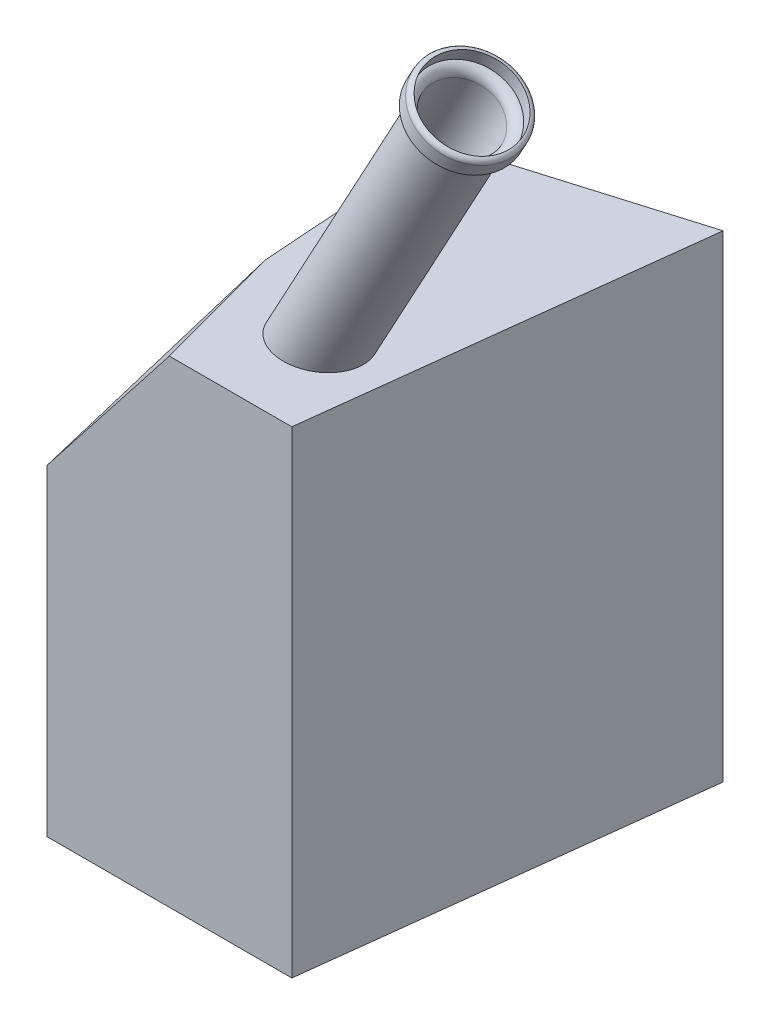
ISO-10303-21;
HEADER;
FILE_DESCRIPTION(('STEP AP214'),'2;1');
FILE_NAME('part.step','',(''),(''),'','','');
FILE_SCHEMA(('AUTOMOTIVE_DESIGN { 1 0 10303 214 1 1 1 1 }'));
ENDSEC;
DATA;
#1=APPLICATION_CONTEXT('core data for automotive mechanical design processes');
#2=APPLICATION_PROTOCOL_DEFINITION('international standard','automotive_design',2000,#1);
#3=PRODUCT_CONTEXT('',#1,'mechanical');
#4=PRODUCT('Part','Part','',(#3));
#5=PRODUCT_RELATED_PRODUCT_CATEGORY('part','',(#4));
#6=PRODUCT_DEFINITION_FORMATION('','',#4);
#7=PRODUCT_DEFINITION_CONTEXT('part definition',#1,'design');
#8=PRODUCT_DEFINITION('design','',#6,#7);
#9=PRODUCT_DEFINITION_SHAPE('','',#8);
#10=(LENGTH_UNIT() NAMED_UNIT(*) SI_UNIT(.MILLI.,.METRE.));
#11=(NAMED_UNIT(*) PLANE_ANGLE_UNIT() SI_UNIT($,.RADIAN.));
#12=(NAMED_UNIT(*) SI_UNIT($,.STERADIAN.) SOLID_ANGLE_UNIT());
#13=UNCERTAINTY_MEASURE_WITH_UNIT(LENGTH_MEASURE(1.E-05),#10,'distance_accuracy_value','');
#14=(GEOMETRIC_REPRESENTATION_CONTEXT(3) GLOBAL_UNCERTAINTY_ASSIGNED_CONTEXT((#13)) GLOBAL_UNIT_ASSIGNED_CONTEXT((#10,
#11,#12)) REPRESENTATION_CONTEXT('',''));
#15=CARTESIAN_POINT('',(0.,0.,0.));
#16=DIRECTION('',(0.,0.,1.));
#17=DIRECTION('',(1.,0.,0.));
#18=AXIS2_PLACEMENT_3D('',#15,#16,#17);
#19=CARTESIAN_POINT('',(81.5417679167685,226.726887822991,-50.2463743663815));
#20=DIRECTION('',(0.496489479395559,0.866025403784438,0.0591455564647714));
#21=DIRECTION('',(-0.867544153281162,0.497360173423316,0.));
#22=AXIS2_PLACEMENT_3D('',#19,#20,#21);
#23=CYLINDRICAL_SURFACE('',#22,20.3962);
#24=CARTESIAN_POINT('',(182.428430129946,402.703249871989,-38.2279972927399));
#25=DIRECTION('',(0.496489479395559,0.866025403784438,0.0591455564647714));
#26=DIRECTION('',(-0.867544153281162,0.497360173423316,0.));
#27=AXIS2_PLACEMENT_3D('',#24,#25,#26);
#28=CIRCLE('',#27,20.3962);
#29=CARTESIAN_POINT('',(164.733826070793,412.847507441165,-38.2279972927399));
#30=VERTEX_POINT('',#29);
#31=EDGE_CURVE('E121',#30,#30,#28,.F.);
#32=ORIENTED_EDGE('',*,*,#31,.T.);
#33=EDGE_LOOP('',(#32));
#34=FACE_BOUND('',#33,.T.);
#35=CARTESIAN_POINT('',(97.177352285412,254.,-48.3837461002978));
#36=DIRECTION('',(0.,-1.,0.));
#37=DIRECTION('',(0.992978958791117,0.,0.118291112929543));
#38=AXIS2_PLACEMENT_3D('',#35,#36,#37);
#39=ELLIPSE('',#38,23.5515031208909,20.3962);
#40=CARTESIAN_POINT('',(120.56349933236,254.,-45.5978125849641));
#41=VERTEX_POINT('',#40);
#42=EDGE_CURVE('E122',#41,#41,#39,.T.);
#43=ORIENTED_EDGE('',*,*,#42,.F.);
#44=EDGE_LOOP('',(#43));
#45=FACE_BOUND('',#44,.T.);
#46=ADVANCED_FACE('F34',(#34,#45),#23,.T.);
#47=CARTESIAN_POINT('',(0.,254.,0.));
#48=DIRECTION('',(0.,0.,-1.));
#49=DIRECTION('',(-1.,0.,0.));
#50=AXIS2_PLACEMENT_3D('',#47,#48,#49);
#51=PLANE('',#50);
#52=DIRECTION('',(-0.617653203910178,-0.78645058312617,0.));
#53=VECTOR('',#52,1.);
#54=CARTESIAN_POINT('',(65.151,254.,0.));
#55=LINE('',#54,#53);
#56=CARTESIAN_POINT('',(65.151,254.,0.));
#57=VERTEX_POINT('',#56);
#58=CARTESIAN_POINT('',(0.,171.043995535229,0.));
#59=VERTEX_POINT('',#58);
#60=EDGE_CURVE('E103',#57,#59,#55,.T.);
#61=ORIENTED_EDGE('',*,*,#60,.T.);
#62=DIRECTION('',(0.,-1.,0.));
#63=VECTOR('',#62,1.);
#64=CARTESIAN_POINT('',(0.,254.,0.));
#65=LINE('',#64,#63);
#66=CARTESIAN_POINT('',(0.,0.,0.));
#67=VERTEX_POINT('',#66);
#68=EDGE_CURVE('E116',#59,#67,#65,.T.);
#69=ORIENTED_EDGE('',*,*,#68,.T.);
#70=DIRECTION('',(1.,0.,0.));
#71=VECTOR('',#70,1.);
#72=CARTESIAN_POINT('',(0.,0.,0.));
#73=LINE('',#72,#71);
#74=CARTESIAN_POINT('',(130.302,0.,0.));
#75=VERTEX_POINT('',#74);
#76=EDGE_CURVE('E102',#67,#75,#73,.T.);
#77=ORIENTED_EDGE('',*,*,#76,.T.);
#78=DIRECTION('',(0.,-1.,0.));
#79=VECTOR('',#78,1.);
#80=CARTESIAN_POINT('',(130.302,254.,0.));
#81=LINE('',#80,#79);
#82=CARTESIAN_POINT('',(130.302,254.,0.));
#83=VERTEX_POINT('',#82);
#84=EDGE_CURVE('E113',#83,#75,#81,.T.);
#85=ORIENTED_EDGE('',*,*,#84,.F.);
#86=DIRECTION('',(1.,0.,0.));
#87=VECTOR('',#86,1.);
#88=CARTESIAN_POINT('',(0.,254.,0.));
#89=LINE('',#88,#87);
#90=EDGE_CURVE('E97',#57,#83,#89,.T.);
#91=ORIENTED_EDGE('',*,*,#90,.F.);
#92=EDGE_LOOP('',(#61,#69,#77,#85,#91));
#93=FACE_BOUND('',#92,.T.);
#94=ADVANCED_FACE('F141',(#93),#51,.F.);
#95=CARTESIAN_POINT('',(-52.1238698428315,254.,-143.209155407773));
#96=DIRECTION('',(0.939692620785909,0.,-0.342020143325666));
#97=DIRECTION('',(-0.342020143325666,0.,-0.939692620785909));
#98=AXIS2_PLACEMENT_3D('',#95,#96,#97);
#99=PLANE('',#98);
#100=ORIENTED_EDGE('',*,*,#68,.F.);
#101=DIRECTION('',(-0.312423370490764,-0.40691769786989,-0.858376155733289));
#102=VECTOR('',#101,1.);
#103=CARTESIAN_POINT('',(-32.9468480454813,128.132175149715,-90.5207210471635));
#104=LINE('',#103,#102);
#105=CARTESIAN_POINT('',(-52.1238698428315,103.154947775462,-143.209155407773));
#106=VERTEX_POINT('',#105);
#107=EDGE_CURVE('E84',#59,#106,#104,.T.);
#108=ORIENTED_EDGE('',*,*,#107,.T.);
#109=DIRECTION('',(0.,-1.,0.));
#110=VECTOR('',#109,1.);
#111=CARTESIAN_POINT('',(-52.1238698428315,254.,-143.209155407773));
#112=LINE('',#111,#110);
#113=CARTESIAN_POINT('',(-52.1238698428315,0.,-143.209155407773));
#114=VERTEX_POINT('',#113);
#115=EDGE_CURVE('E76',#106,#114,#112,.T.);
#116=ORIENTED_EDGE('',*,*,#115,.T.);
#117=DIRECTION('',(0.342020143325666,0.,0.939692620785909));
#118=VECTOR('',#117,1.);
#119=CARTESIAN_POINT('',(-52.1238698428315,0.,-143.209155407773));
#120=LINE('',#119,#118);
#121=EDGE_CURVE('E81',#114,#67,#120,.T.);
#122=ORIENTED_EDGE('',*,*,#121,.T.);
#123=EDGE_LOOP('',(#100,#108,#116,#122));
#124=FACE_BOUND('',#123,.T.);
#125=ADVANCED_FACE('F79',(#124),#99,.F.);
#126=CARTESIAN_POINT('',(130.302,254.,0.));
#127=DIRECTION('',(-0.992978958791117,0.,-0.118291112929543));
#128=DIRECTION('',(-0.118291112929543,0.,0.992978958791117));
#129=AXIS2_PLACEMENT_3D('',#126,#127,#128);
#130=PLANE('',#129);
#131=DIRECTION('',(0.118291112929543,0.,-0.992978958791117));
#132=VECTOR('',#131,1.);
#133=CARTESIAN_POINT('',(130.302,0.,0.));
#134=LINE('',#133,#132);
#135=CARTESIAN_POINT('',(154.729351402176,0.,-205.052140948283));
#136=VERTEX_POINT('',#135);
#137=EDGE_CURVE('E98',#75,#136,#134,.T.);
#138=ORIENTED_EDGE('',*,*,#137,.T.);
#139=DIRECTION('',(0.,-1.,0.));
#140=VECTOR('',#139,1.);
#141=CARTESIAN_POINT('',(154.729351402176,254.,-205.052140948283));
#142=LINE('',#141,#140);
#143=CARTESIAN_POINT('',(154.729351402176,254.,-205.052140948283));
#144=VERTEX_POINT('',#143);
#145=EDGE_CURVE('E87',#144,#136,#142,.T.);
#146=ORIENTED_EDGE('',*,*,#145,.F.);
#147=DIRECTION('',(0.118291112929543,0.,-0.992978958791117));
#148=VECTOR('',#147,1.);
#149=CARTESIAN_POINT('',(130.302,254.,0.));
#150=LINE('',#149,#148);
#151=EDGE_CURVE('E56',#83,#144,#150,.T.);
#152=ORIENTED_EDGE('',*,*,#151,.F.);
#153=ORIENTED_EDGE('',*,*,#84,.T.);
#154=EDGE_LOOP('',(#138,#146,#152,#153));
#155=FACE_BOUND('',#154,.T.);
#156=ADVANCED_FACE('F289',(#155),#130,.F.);
#157=CARTESIAN_POINT('',(154.729351402176,254.,-205.052140948283));
#158=DIRECTION('',(0.286442730618391,0.,0.958097365655433));
#159=DIRECTION('',(0.958097365655433,0.,-0.286442730618391));
#160=AXIS2_PLACEMENT_3D('',#157,#158,#159);
#161=PLANE('',#160);
#162=ORIENTED_EDGE('',*,*,#115,.F.);
#163=DIRECTION('',(0.512039136018785,0.84521065349225,-0.153084533537326));
#164=VECTOR('',#163,1.);
#165=CARTESIAN_POINT('',(72.240192671489,308.439706604567,-180.390326063668));
#166=LINE('',#165,#164);
#167=CARTESIAN_POINT('',(39.2599406837229,254.,-170.530207693135));
#168=VERTEX_POINT('',#167);
#169=EDGE_CURVE('E156',#106,#168,#166,.T.);
#170=ORIENTED_EDGE('',*,*,#169,.T.);
#171=DIRECTION('',(-0.958097365655433,0.,0.286442730618391));
#172=VECTOR('',#171,1.);
#173=CARTESIAN_POINT('',(154.729351402176,254.,-205.052140948283));
#174=LINE('',#173,#172);
#175=EDGE_CURVE('E88',#144,#168,#174,.T.);
#176=ORIENTED_EDGE('',*,*,#175,.F.);
#177=ORIENTED_EDGE('',*,*,#145,.T.);
#178=DIRECTION('',(-0.958097365655433,0.,0.286442730618391));
#179=VECTOR('',#178,1.);
#180=CARTESIAN_POINT('',(154.729351402176,0.,-205.052140948283));
#181=LINE('',#180,#179);
#182=EDGE_CURVE('E92',#136,#114,#181,.T.);
#183=ORIENTED_EDGE('',*,*,#182,.T.);
#184=EDGE_LOOP('',(#162,#170,#176,#177,#183));
#185=FACE_BOUND('',#184,.T.);
#186=ADVANCED_FACE('F93',(#185),#161,.F.);
#187=CARTESIAN_POINT('',(0.,254.,0.));
#188=DIRECTION('',(0.,-1.,0.));
#189=DIRECTION('',(0.,0.,-1.));
#190=AXIS2_PLACEMENT_3D('',#187,#188,#189);
#191=PLANE('',#190);
#192=ORIENTED_EDGE('',*,*,#42,.T.);
#193=EDGE_LOOP('',(#192));
#194=FACE_BOUND('',#193,.T.);
#195=ORIENTED_EDGE('',*,*,#175,.T.);
#196=DIRECTION('',(0.0705343070797414,0.,0.997509354103901));
#197=VECTOR('',#196,1.);
#198=CARTESIAN_POINT('',(51.0628909793131,254.,-3.61067855443798));
#199=LINE('',#198,#197);
#200=CARTESIAN_POINT('',(46.3783747708351,254.,-69.859982345364));
#201=VERTEX_POINT('',#200);
#202=EDGE_CURVE('E125',#168,#201,#199,.T.);
#203=ORIENTED_EDGE('',*,*,#202,.T.);
#204=DIRECTION('',(0.259511588226898,0.,0.965739993774697));
#205=VECTOR('',#204,1.);
#206=CARTESIAN_POINT('',(65.151,254.,0.));
#207=LINE('',#206,#205);
#208=EDGE_CURVE('E49',#201,#57,#207,.T.);
#209=ORIENTED_EDGE('',*,*,#208,.T.);
#210=ORIENTED_EDGE('',*,*,#90,.T.);
#211=ORIENTED_EDGE('',*,*,#151,.T.);
#212=EDGE_LOOP('',(#195,#203,#209,#210,#211));
#213=FACE_BOUND('',#212,.T.);
#214=ADVANCED_FACE('F145',(#194,#213),#191,.F.);
#215=CARTESIAN_POINT('',(0.,0.,0.));
#216=DIRECTION('',(0.,-1.,0.));
#217=DIRECTION('',(0.,0.,-1.));
#218=AXIS2_PLACEMENT_3D('',#215,#216,#217);
#219=PLANE('',#218);
#220=ORIENTED_EDGE('',*,*,#121,.F.);
#221=ORIENTED_EDGE('',*,*,#182,.F.);
#222=ORIENTED_EDGE('',*,*,#137,.F.);
#223=ORIENTED_EDGE('',*,*,#76,.F.);
#224=EDGE_LOOP('',(#220,#221,#222,#223));
#225=FACE_BOUND('',#224,.T.);
#226=ADVANCED_FACE('F101',(#225),#219,.T.);
#227=CARTESIAN_POINT('',(-79.533165386549,62.4628113604426,21.3719823132758));
#228=DIRECTION('',(-0.769455640153619,0.604305917758337,0.206766476001402));
#229=DIRECTION('',(-0.617653203910178,-0.78645058312617,0.));
#230=AXIS2_PLACEMENT_3D('',#227,#228,#229);
#231=PLANE('',#230);
#232=DIRECTION('',(0.393191435141361,0.703293088864513,-0.592266263167917));
#233=VECTOR('',#232,1.);
#234=CARTESIAN_POINT('',(-47.2985940713895,86.4420145397452,71.24611336889));
#235=LINE('',#234,#233);
#236=EDGE_CURVE('E118',#59,#201,#235,.T.);
#237=ORIENTED_EDGE('',*,*,#236,.F.);
#238=ORIENTED_EDGE('',*,*,#60,.F.);
#239=ORIENTED_EDGE('',*,*,#208,.F.);
#240=EDGE_LOOP('',(#237,#238,#239));
#241=FACE_BOUND('',#240,.T.);
#242=ADVANCED_FACE('F284',(#241),#231,.T.);
#243=CARTESIAN_POINT('',(-76.2498459165135,47.1696430068731,5.39165875942065));
#244=DIRECTION('',(0.848894577085888,-0.5251427549828,-0.0600256935257437));
#245=DIRECTION('',(0.526091385950051,0.85042804141747,0.));
#246=AXIS2_PLACEMENT_3D('',#243,#244,#245);
#247=PLANE('',#246);
#248=ORIENTED_EDGE('',*,*,#236,.T.);
#249=ORIENTED_EDGE('',*,*,#202,.F.);
#250=ORIENTED_EDGE('',*,*,#169,.F.);
#251=ORIENTED_EDGE('',*,*,#107,.F.);
#252=EDGE_LOOP('',(#248,#249,#250,#251));
#253=FACE_BOUND('',#252,.T.);
#254=ADVANCED_FACE('F282',(#253),#247,.F.);
#255=CARTESIAN_POINT('',(183.689513407611,404.902954397601,-38.0777675793194));
#256=DIRECTION('',(0.496489479395559,0.866025403784438,0.0591455564647714));
#257=DIRECTION('',(-0.867544153281162,0.497360173423316,0.));
#258=AXIS2_PLACEMENT_3D('',#255,#256,#257);
#259=CYLINDRICAL_SURFACE('',#258,25.4762);
#260=CARTESIAN_POINT('',(187.472763240605,411.502067974438,-37.6270784390579));
#261=DIRECTION('',(0.496489479395559,0.866025403784438,0.0591455564647714));
#262=DIRECTION('',(-0.867544153281162,0.497360173423316,0.));
#263=AXIS2_PLACEMENT_3D('',#260,#261,#262);
#264=CIRCLE('',#263,25.4762);
#265=CARTESIAN_POINT('',(165.371034882783,424.172915224605,-37.6270784390579));
#266=VERTEX_POINT('',#265);
#267=EDGE_CURVE('E11',#266,#266,#264,.F.);
#268=ORIENTED_EDGE('',*,*,#267,.T.);
#269=EDGE_LOOP('',(#268));
#270=FACE_BOUND('',#269,.T.);
#271=CARTESIAN_POINT('',(183.689513407611,404.902954397601,-38.0777675793194));
#272=DIRECTION('',(0.496489479395559,0.866025403784438,0.0591455564647714));
#273=DIRECTION('',(-0.867544153281162,0.497360173423316,0.));
#274=AXIS2_PLACEMENT_3D('',#271,#272,#273);
#275=CIRCLE('',#274,25.4762);
#276=CARTESIAN_POINT('',(161.587785049789,417.573801647768,-38.0777675793194));
#277=VERTEX_POINT('',#276);
#278=EDGE_CURVE('E126',#277,#277,#275,.T.);
#279=ORIENTED_EDGE('',*,*,#278,.T.);
#280=EDGE_LOOP('',(#279));
#281=FACE_BOUND('',#280,.T.);
#282=ADVANCED_FACE('F336',(#270,#281),#259,.T.);
#283=CARTESIAN_POINT('',(183.689513407611,404.902954397601,-38.0777675793194));
#284=DIRECTION('',(0.496489479395559,0.866025403784438,0.0591455564647714));
#285=DIRECTION('',(-0.867544153281162,0.497360173423316,0.));
#286=AXIS2_PLACEMENT_3D('',#283,#284,#285);
#287=PLANE('',#286);
#288=CARTESIAN_POINT('',(183.689513407611,404.902954397601,-38.0777675793194));
#289=DIRECTION('',(0.496489479395559,0.866025403784438,0.0591455564647714));
#290=DIRECTION('',(-0.867544153281162,0.497360173423316,0.));
#291=AXIS2_PLACEMENT_3D('',#288,#289,#290);
#292=CIRCLE('',#291,22.9362);
#293=CARTESIAN_POINT('',(163.791347199124,416.310506807273,-38.0777675793194));
#294=VERTEX_POINT('',#293);
#295=EDGE_CURVE('E42',#294,#294,#292,.T.);
#296=ORIENTED_EDGE('',*,*,#295,.T.);
#297=EDGE_LOOP('',(#296));
#298=FACE_BOUND('',#297,.T.);
#299=ORIENTED_EDGE('',*,*,#278,.F.);
#300=EDGE_LOOP('',(#299));
#301=FACE_BOUND('',#300,.T.);
#302=ADVANCED_FACE('F131',(#298,#301),#287,.F.);
#303=CARTESIAN_POINT('',(182.428430129946,402.703249871989,-38.2279972927399));
#304=DIRECTION('',(0.496489479395559,0.866025403784438,0.0591455564647714));
#305=DIRECTION('',(-0.867544153281162,0.497360173423316,0.));
#306=AXIS2_PLACEMENT_3D('',#303,#304,#305);
#307=TOROIDAL_SURFACE('',#306,22.9362,2.54);
#308=ORIENTED_EDGE('',*,*,#295,.F.);
#309=EDGE_LOOP('',(#308));
#310=FACE_BOUND('',#309,.T.);
#311=ORIENTED_EDGE('',*,*,#31,.F.);
#312=EDGE_LOOP('',(#311));
#313=FACE_BOUND('',#312,.T.);
#314=ADVANCED_FACE('F134',(#310,#313),#307,.F.);
#315=CARTESIAN_POINT('',(187.472763240605,411.502067974438,-37.6270784390579));
#316=DIRECTION('',(0.496489479395559,0.866025403784438,0.0591455564647714));
#317=DIRECTION('',(-0.867544153281162,0.497360173423316,0.));
#318=AXIS2_PLACEMENT_3D('',#315,#316,#317);
#319=TOROIDAL_SURFACE('',#318,22.9362,2.54);
#320=ORIENTED_EDGE('',*,*,#267,.F.);
#321=EDGE_LOOP('',(#320));
#322=FACE_BOUND('',#321,.T.);
#323=CARTESIAN_POINT('',(188.73384651827,413.701772500051,-37.4768487256373));
#324=DIRECTION('',(0.496489479395559,0.866025403784438,0.0591455564647714));
#325=DIRECTION('',(-0.867544153281162,0.497360173423316,0.));
#326=AXIS2_PLACEMENT_3D('',#323,#324,#325);
#327=CIRCLE('',#326,22.9362);
#328=CARTESIAN_POINT('',(168.835680309782,425.109324909723,-37.4768487256373));
#329=VERTEX_POINT('',#328);
#330=EDGE_CURVE('E162',#329,#329,#327,.T.);
#331=ORIENTED_EDGE('',*,*,#330,.F.);
#332=EDGE_LOOP('',(#331));
#333=FACE_BOUND('',#332,.T.);
#334=ADVANCED_FACE('F36',(#322,#333),#319,.T.);
#335=CARTESIAN_POINT('',(81.5417679167685,226.726887822991,-50.2463743663815));
#336=DIRECTION('',(0.496489479395559,0.866025403784438,0.0591455564647714));
#337=DIRECTION('',(-0.867544153281162,0.497360173423316,0.));
#338=AXIS2_PLACEMENT_3D('',#335,#336,#337);
#339=CYLINDRICAL_SURFACE('',#338,17.8562);
#340=CARTESIAN_POINT('',(182.428430129946,402.703249871989,-38.2279972927399));
#341=DIRECTION('',(0.496489479395559,0.866025403784438,0.0591455564647714));
#342=DIRECTION('',(-0.867544153281162,0.497360173423316,0.));
#343=AXIS2_PLACEMENT_3D('',#340,#341,#342);
#344=CIRCLE('',#343,17.8562);
#345=CARTESIAN_POINT('',(166.937388220127,411.58421260067,-38.2279972927399));
#346=VERTEX_POINT('',#345);
#347=EDGE_CURVE('E165',#346,#346,#344,.F.);
#348=ORIENTED_EDGE('',*,*,#347,.F.);
#349=EDGE_LOOP('',(#348));
#350=FACE_BOUND('',#349,.T.);
#351=CARTESIAN_POINT('',(95.7211787457515,251.46,-48.5572164312651));
#352=DIRECTION('',(0.,-1.,0.));
#353=DIRECTION('',(0.992978958791117,0.,0.118291112929543));
#354=AXIS2_PLACEMENT_3D('',#351,#352,#353);
#355=ELLIPSE('',#354,20.6185637534076,17.8562);
#356=CARTESIAN_POINT('',(116.194978713378,251.46,-46.1182235778658));
#357=VERTEX_POINT('',#356);
#358=EDGE_CURVE('E171',#357,#357,#355,.T.);
#359=ORIENTED_EDGE('',*,*,#358,.T.);
#360=EDGE_LOOP('',(#359));
#361=FACE_BOUND('',#360,.T.);
#362=ADVANCED_FACE('F230',(#350,#361),#339,.F.);
#363=CARTESIAN_POINT('',(0.,254.,-2.54));
#364=DIRECTION('',(0.,0.,-1.));
#365=DIRECTION('',(-1.,0.,0.));
#366=AXIS2_PLACEMENT_3D('',#363,#364,#365);
#367=PLANE('',#366);
#368=DIRECTION('',(-0.617653203910178,-0.78645058312617,0.));
#369=VECTOR('',#368,1.);
#370=CARTESIAN_POINT('',(-81.4657086168373,63.9805691744653,-2.54));
#371=LINE('',#370,#369);
#372=CARTESIAN_POINT('',(65.7746566408877,251.46,-2.54));
#373=VERTEX_POINT('',#372);
#374=CARTESIAN_POINT('',(3.53235440825422,172.207606300625,-2.54));
#375=VERTEX_POINT('',#374);
#376=EDGE_CURVE('E197',#373,#375,#371,.T.);
#377=ORIENTED_EDGE('',*,*,#376,.F.);
#378=DIRECTION('',(1.,0.,0.));
#379=VECTOR('',#378,1.);
#380=CARTESIAN_POINT('',(0.,251.46,-2.54));
#381=LINE('',#380,#379);
#382=CARTESIAN_POINT('',(128.046624341401,251.46,-2.54));
#383=VERTEX_POINT('',#382);
#384=EDGE_CURVE('E183',#373,#383,#381,.T.);
#385=ORIENTED_EDGE('',*,*,#384,.T.);
#386=DIRECTION('',(0.,-1.,0.));
#387=VECTOR('',#386,1.);
#388=CARTESIAN_POINT('',(128.046624341401,254.,-2.54));
#389=LINE('',#388,#387);
#390=CARTESIAN_POINT('',(128.046624341401,2.54,-2.54));
#391=VERTEX_POINT('',#390);
#392=EDGE_CURVE('E187',#383,#391,#389,.T.);
#393=ORIENTED_EDGE('',*,*,#392,.T.);
#394=DIRECTION('',(1.,0.,0.));
#395=VECTOR('',#394,1.);
#396=CARTESIAN_POINT('',(0.,2.54,-2.54));
#397=LINE('',#396,#395);
#398=CARTESIAN_POINT('',(1.77852714705267,2.54,-2.54));
#399=VERTEX_POINT('',#398);
#400=EDGE_CURVE('E180',#399,#391,#397,.T.);
#401=ORIENTED_EDGE('',*,*,#400,.F.);
#402=DIRECTION('',(0.,-1.,0.));
#403=VECTOR('',#402,1.);
#404=CARTESIAN_POINT('',(1.77852714705267,254.,-2.54));
#405=LINE('',#404,#403);
#406=CARTESIAN_POINT('',(1.77852714705266,169.372540145655,-2.54));
#407=VERTEX_POINT('',#406);
#408=EDGE_CURVE('E175',#407,#399,#405,.T.);
#409=ORIENTED_EDGE('',*,*,#408,.F.);
#410=DIRECTION('',(0.526091385950051,0.85042804141747,0.));
#411=VECTOR('',#410,1.);
#412=CARTESIAN_POINT('',(-74.4914796742973,46.0818833278374,-2.54));
#413=LINE('',#412,#411);
#414=EDGE_CURVE('E161',#407,#375,#413,.T.);
#415=ORIENTED_EDGE('',*,*,#414,.T.);
#416=EDGE_LOOP('',(#377,#385,#393,#401,#409,#415));
#417=FACE_BOUND('',#416,.T.);
#418=ADVANCED_FACE('F233',(#417),#367,.T.);
#419=CARTESIAN_POINT('',(-49.7370505860353,254.,-144.07788657182));
#420=DIRECTION('',(0.939692620785909,0.,-0.342020143325666));
#421=DIRECTION('',(-0.342020143325666,0.,-0.939692620785909));
#422=AXIS2_PLACEMENT_3D('',#419,#420,#421);
#423=PLANE('',#422);
#424=ORIENTED_EDGE('',*,*,#408,.T.);
#425=DIRECTION('',(0.342020143325666,0.,0.939692620785909));
#426=VECTOR('',#425,1.);
#427=CARTESIAN_POINT('',(2.38681925679621,2.54,-0.868731164047191));
#428=LINE('',#427,#426);
#429=CARTESIAN_POINT('',(-48.8159022024725,2.54,-141.547052188014));
#430=VERTEX_POINT('',#429);
#431=EDGE_CURVE('E194',#430,#399,#428,.T.);
#432=ORIENTED_EDGE('',*,*,#431,.F.);
#433=DIRECTION('',(0.,-1.,0.));
#434=VECTOR('',#433,1.);
#435=CARTESIAN_POINT('',(-48.8159022024725,254.,-141.547052188014));
#436=LINE('',#435,#434);
#437=CARTESIAN_POINT('',(-48.8159022024725,103.475521354744,-141.547052188014));
#438=VERTEX_POINT('',#437);
#439=EDGE_CURVE('E188',#438,#430,#436,.T.);
#440=ORIENTED_EDGE('',*,*,#439,.F.);
#441=DIRECTION('',(-0.312423370490764,-0.40691769786989,-0.858376155733289));
#442=VECTOR('',#441,1.);
#443=CARTESIAN_POINT('',(-30.4482578962662,127.398570147905,-91.0823642081373));
#444=LINE('',#443,#442);
#445=EDGE_CURVE('E192',#407,#438,#444,.T.);
#446=ORIENTED_EDGE('',*,*,#445,.F.);
#447=EDGE_LOOP('',(#424,#432,#440,#446));
#448=FACE_BOUND('',#447,.T.);
#449=ADVANCED_FACE('F392',(#448),#423,.T.);
#450=CARTESIAN_POINT('',(127.779833444671,254.,-0.300459426841038));
#451=DIRECTION('',(-0.992978958791117,0.,-0.118291112929543));
#452=DIRECTION('',(-0.118291112929543,0.,0.992978958791117));
#453=AXIS2_PLACEMENT_3D('',#450,#451,#452);
#454=PLANE('',#453);
#455=DIRECTION('',(0.118291112929543,0.,-0.992978958791117));
#456=VECTOR('',#455,1.);
#457=CARTESIAN_POINT('',(125.956545261122,2.54,15.0048898698091));
#458=LINE('',#457,#456);
#459=CARTESIAN_POINT('',(151.749443187696,2.54,-201.510149113637));
#460=VERTEX_POINT('',#459);
#461=EDGE_CURVE('E176',#391,#460,#458,.T.);
#462=ORIENTED_EDGE('',*,*,#461,.F.);
#463=ORIENTED_EDGE('',*,*,#392,.F.);
#464=DIRECTION('',(0.118291112929543,0.,-0.992978958791117));
#465=VECTOR('',#464,1.);
#466=CARTESIAN_POINT('',(125.956545261122,251.46,15.0048898698091));
#467=LINE('',#466,#465);
#468=CARTESIAN_POINT('',(151.749443187696,251.46,-201.510149113637));
#469=VERTEX_POINT('',#468);
#470=EDGE_CURVE('E212',#383,#469,#467,.T.);
#471=ORIENTED_EDGE('',*,*,#470,.T.);
#472=DIRECTION('',(0.,-1.,0.));
#473=VECTOR('',#472,1.);
#474=CARTESIAN_POINT('',(151.749443187696,254.,-201.510149113637));
#475=LINE('',#474,#473);
#476=EDGE_CURVE('E184',#469,#460,#475,.T.);
#477=ORIENTED_EDGE('',*,*,#476,.T.);
#478=EDGE_LOOP('',(#462,#463,#471,#477));
#479=FACE_BOUND('',#478,.T.);
#480=ADVANCED_FACE('F402',(#479),#454,.T.);
#481=CARTESIAN_POINT('',(155.456915937947,254.,-202.618573639518));
#482=DIRECTION('',(0.286442730618391,0.,0.958097365655433));
#483=DIRECTION('',(0.958097365655433,0.,-0.286442730618391));
#484=AXIS2_PLACEMENT_3D('',#481,#482,#483);
#485=PLANE('',#484);
#486=ORIENTED_EDGE('',*,*,#439,.T.);
#487=DIRECTION('',(-0.958097365655433,0.,0.286442730618391));
#488=VECTOR('',#487,1.);
#489=CARTESIAN_POINT('',(-42.8514939659085,2.54,-143.330233567117));
#490=LINE('',#489,#488);
#491=EDGE_CURVE('E179',#460,#430,#490,.T.);
#492=ORIENTED_EDGE('',*,*,#491,.F.);
#493=ORIENTED_EDGE('',*,*,#476,.F.);
#494=DIRECTION('',(-0.958097365655433,0.,0.286442730618391));
#495=VECTOR('',#494,1.);
#496=CARTESIAN_POINT('',(-42.8514939659085,251.46,-143.330233567117));
#497=LINE('',#496,#495);
#498=CARTESIAN_POINT('',(40.8349372381143,251.46,-168.349997454464));
#499=VERTEX_POINT('',#498);
#500=EDGE_CURVE('E200',#469,#499,#497,.T.);
#501=ORIENTED_EDGE('',*,*,#500,.T.);
#502=DIRECTION('',(0.512039136018785,0.84521065349225,-0.153084533537326));
#503=VECTOR('',#502,1.);
#504=CARTESIAN_POINT('',(74.6724101507199,307.314700512463,-178.466399488074));
#505=LINE('',#504,#503);
#506=EDGE_CURVE('E189',#438,#499,#505,.T.);
#507=ORIENTED_EDGE('',*,*,#506,.F.);
#508=EDGE_LOOP('',(#486,#492,#493,#501,#507));
#509=FACE_BOUND('',#508,.T.);
#510=ADVANCED_FACE('F241',(#509),#485,.T.);
#511=CARTESIAN_POINT('',(0.,251.46,0.));
#512=DIRECTION('',(0.,-1.,0.));
#513=DIRECTION('',(0.,0.,-1.));
#514=AXIS2_PLACEMENT_3D('',#511,#512,#513);
#515=PLANE('',#514);
#516=ORIENTED_EDGE('',*,*,#358,.F.);
#517=EDGE_LOOP('',(#516));
#518=FACE_BOUND('',#517,.T.);
#519=ORIENTED_EDGE('',*,*,#500,.F.);
#520=ORIENTED_EDGE('',*,*,#470,.F.);
#521=ORIENTED_EDGE('',*,*,#384,.F.);
#522=DIRECTION('',(0.259511588226898,0.,0.965739993774697));
#523=VECTOR('',#522,1.);
#524=CARTESIAN_POINT('',(61.9815558501302,251.46,-16.6555512903342));
#525=LINE('',#524,#523);
#526=CARTESIAN_POINT('',(47.8401443047202,251.46,-69.2810497936574));
#527=VERTEX_POINT('',#526);
#528=EDGE_CURVE('E203',#527,#373,#525,.T.);
#529=ORIENTED_EDGE('',*,*,#528,.F.);
#530=DIRECTION('',(0.0705343070797414,0.,0.997509354103901));
#531=VECTOR('',#530,1.);
#532=CARTESIAN_POINT('',(52.4766551786011,251.46,-3.71064641715592));
#533=LINE('',#532,#531);
#534=EDGE_CURVE('E193',#499,#527,#533,.T.);
#535=ORIENTED_EDGE('',*,*,#534,.F.);
#536=EDGE_LOOP('',(#519,#520,#521,#529,#535));
#537=FACE_BOUND('',#536,.T.);
#538=ADVANCED_FACE('F237',(#518,#537),#515,.T.);
#539=CARTESIAN_POINT('',(0.,2.54,0.));
#540=DIRECTION('',(0.,-1.,0.));
#541=DIRECTION('',(0.,0.,-1.));
#542=AXIS2_PLACEMENT_3D('',#539,#540,#541);
#543=PLANE('',#542);
#544=ORIENTED_EDGE('',*,*,#431,.T.);
#545=ORIENTED_EDGE('',*,*,#400,.T.);
#546=ORIENTED_EDGE('',*,*,#461,.T.);
#547=ORIENTED_EDGE('',*,*,#491,.T.);
#548=EDGE_LOOP('',(#544,#545,#546,#547));
#549=FACE_BOUND('',#548,.T.);
#550=ADVANCED_FACE('F240',(#549),#543,.F.);
#551=CARTESIAN_POINT('',(-77.5787480605588,60.9278743293364,20.8467954642322));
#552=DIRECTION('',(-0.769455640153619,0.604305917758337,0.206766476001402));
#553=DIRECTION('',(-0.617653203910178,-0.78645058312617,0.));
#554=AXIS2_PLACEMENT_3D('',#551,#552,#553);
#555=PLANE('',#554);
#556=DIRECTION('',(0.393191435141361,0.703293088864513,-0.592266263167917));
#557=VECTOR('',#556,1.);
#558=CARTESIAN_POINT('',(-45.2256118315029,84.9952776007842,70.9043731057015));
#559=LINE('',#558,#557);
#560=EDGE_CURVE('E172',#375,#527,#559,.T.);
#561=ORIENTED_EDGE('',*,*,#560,.T.);
#562=ORIENTED_EDGE('',*,*,#528,.T.);
#563=ORIENTED_EDGE('',*,*,#376,.T.);
#564=EDGE_LOOP('',(#561,#562,#563));
#565=FACE_BOUND('',#564,.T.);
#566=ADVANCED_FACE('F435',(#565),#555,.F.);
#567=CARTESIAN_POINT('',(-74.0936536907153,45.8357804092168,5.23919349786526));
#568=DIRECTION('',(0.848894577085888,-0.5251427549828,-0.0600256935257437));
#569=DIRECTION('',(0.526091385950051,0.85042804141747,0.));
#570=AXIS2_PLACEMENT_3D('',#567,#568,#569);
#571=PLANE('',#570);
#572=ORIENTED_EDGE('',*,*,#560,.F.);
#573=ORIENTED_EDGE('',*,*,#414,.F.);
#574=ORIENTED_EDGE('',*,*,#445,.T.);
#575=ORIENTED_EDGE('',*,*,#506,.T.);
#576=ORIENTED_EDGE('',*,*,#534,.T.);
#577=EDGE_LOOP('',(#572,#573,#574,#575,#576));
#578=FACE_BOUND('',#577,.T.);
#579=ADVANCED_FACE('F445',(#578),#571,.T.);
#580=CARTESIAN_POINT('',(183.689513407611,404.902954397601,-38.0777675793194));
#581=DIRECTION('',(0.496489479395559,0.866025403784438,0.0591455564647714));
#582=DIRECTION('',(-0.867544153281162,0.497360173423316,0.));
#583=AXIS2_PLACEMENT_3D('',#580,#581,#582);
#584=CYLINDRICAL_SURFACE('',#583,22.9362);
#585=ORIENTED_EDGE('',*,*,#330,.T.);
#586=EDGE_LOOP('',(#585));
#587=FACE_BOUND('',#586,.T.);
#588=CARTESIAN_POINT('',(184.950596685276,407.102658923214,-37.9275378658989));
#589=DIRECTION('',(0.496489479395559,0.866025403784438,0.0591455564647714));
#590=DIRECTION('',(-0.867544153281162,0.497360173423316,0.));
#591=AXIS2_PLACEMENT_3D('',#588,#589,#590);
#592=CIRCLE('',#591,22.9362);
#593=CARTESIAN_POINT('',(165.052430476788,418.510211332885,-37.9275378658989));
#594=VERTEX_POINT('',#593);
#595=EDGE_CURVE('E168',#594,#594,#592,.T.);
#596=ORIENTED_EDGE('',*,*,#595,.F.);
#597=EDGE_LOOP('',(#596));
#598=FACE_BOUND('',#597,.T.);
#599=ADVANCED_FACE('F455',(#587,#598),#584,.F.);
#600=CARTESIAN_POINT('',(182.428430129946,402.703249871989,-38.2279972927399));
#601=DIRECTION('',(0.496489479395559,0.866025403784438,0.0591455564647714));
#602=DIRECTION('',(-0.867544153281162,0.497360173423316,0.));
#603=AXIS2_PLACEMENT_3D('',#600,#601,#602);
#604=TOROIDAL_SURFACE('',#603,22.9362,5.08);
#605=ORIENTED_EDGE('',*,*,#595,.T.);
#606=EDGE_LOOP('',(#605));
#607=FACE_BOUND('',#606,.T.);
#608=ORIENTED_EDGE('',*,*,#347,.T.);
#609=EDGE_LOOP('',(#608));
#610=FACE_BOUND('',#609,.T.);
#611=ADVANCED_FACE('F228',(#607,#610),#604,.T.);
#612=CLOSED_SHELL('',(#46,#94,#125,#156,#186,#214,#226,#242,#254,#282,#302,#314,#334,#362,#418,
#449,#480,#510,#538,#550,#566,#579,#599,#611));
#613=MANIFOLD_SOLID_BREP('B2',#612);
#614=ADVANCED_BREP_SHAPE_REPRESENTATION('',(#18,#613),#14);
#615=SHAPE_DEFINITION_REPRESENTATION(#9,#614);
ENDSEC;
END-ISO-10303-21;
